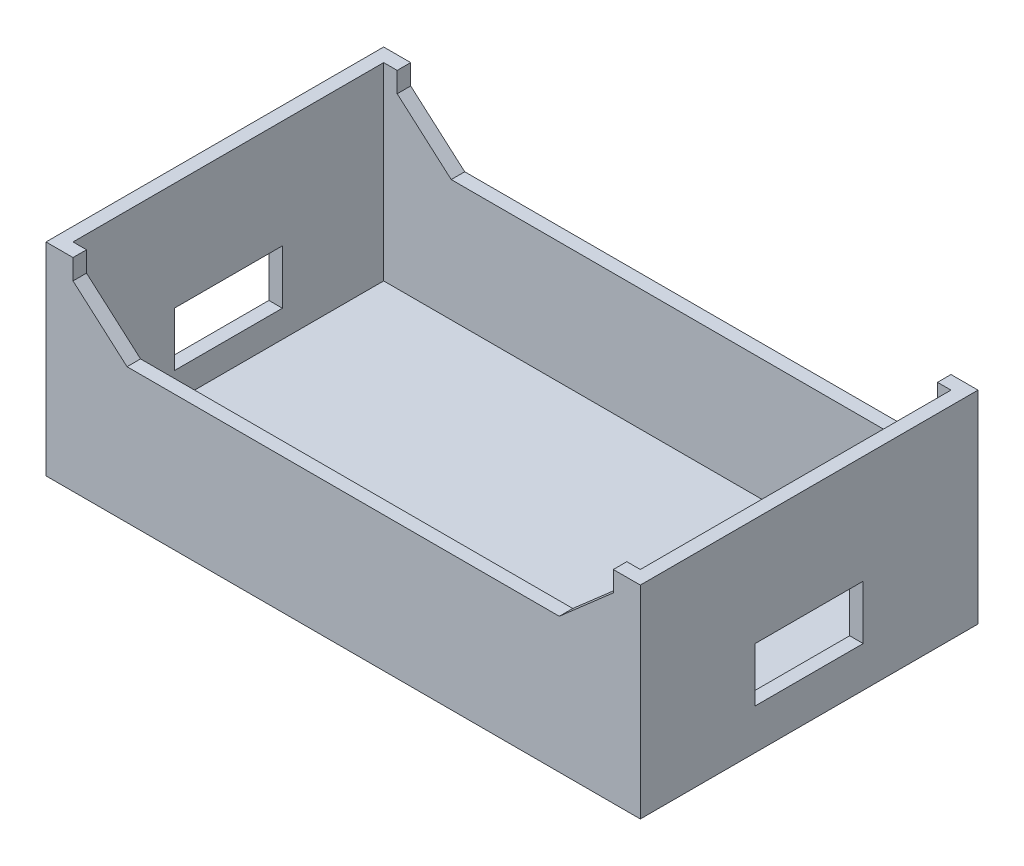
ISO-10303-21;
HEADER;
FILE_DESCRIPTION(('STEP AP214'),'2;1');
FILE_NAME('part.step','',(''),(''),'','','');
FILE_SCHEMA(('AUTOMOTIVE_DESIGN { 1 0 10303 214 1 1 1 1 }'));
ENDSEC;
DATA;
#1=APPLICATION_CONTEXT('core data for automotive mechanical design processes');
#2=APPLICATION_PROTOCOL_DEFINITION('international standard','automotive_design',2000,#1);
#3=PRODUCT_CONTEXT('',#1,'mechanical');
#4=PRODUCT('Part','Part','',(#3));
#5=PRODUCT_RELATED_PRODUCT_CATEGORY('part','',(#4));
#6=PRODUCT_DEFINITION_FORMATION('','',#4);
#7=PRODUCT_DEFINITION_CONTEXT('part definition',#1,'design');
#8=PRODUCT_DEFINITION('design','',#6,#7);
#9=PRODUCT_DEFINITION_SHAPE('','',#8);
#10=(LENGTH_UNIT() NAMED_UNIT(*) SI_UNIT(.MILLI.,.METRE.));
#11=(NAMED_UNIT(*) PLANE_ANGLE_UNIT() SI_UNIT($,.RADIAN.));
#12=(NAMED_UNIT(*) SI_UNIT($,.STERADIAN.) SOLID_ANGLE_UNIT());
#13=UNCERTAINTY_MEASURE_WITH_UNIT(LENGTH_MEASURE(1.E-05),#10,'distance_accuracy_value','');
#14=(GEOMETRIC_REPRESENTATION_CONTEXT(3) GLOBAL_UNCERTAINTY_ASSIGNED_CONTEXT((#13)) GLOBAL_UNIT_ASSIGNED_CONTEXT((#10,
#11,#12)) REPRESENTATION_CONTEXT('',''));
#15=CARTESIAN_POINT('',(0.,0.,0.));
#16=DIRECTION('',(0.,0.,1.));
#17=DIRECTION('',(1.,0.,0.));
#18=AXIS2_PLACEMENT_3D('',#15,#16,#17);
#19=CARTESIAN_POINT('',(21.,1.,-11.5));
#20=DIRECTION('',(0.,0.,-1.));
#21=DIRECTION('',(-1.,0.,0.));
#22=AXIS2_PLACEMENT_3D('',#19,#20,#21);
#23=PLANE('',#22);
#24=DIRECTION('',(0.,1.,0.));
#25=VECTOR('',#24,1.);
#26=CARTESIAN_POINT('',(21.,1.,-11.5));
#27=LINE('',#26,#25);
#28=CARTESIAN_POINT('',(21.,1.,-11.5));
#29=VERTEX_POINT('',#28);
#30=CARTESIAN_POINT('',(21.,15.,-11.5));
#31=VERTEX_POINT('',#30);
#32=EDGE_CURVE('E396',#29,#31,#27,.T.);
#33=ORIENTED_EDGE('',*,*,#32,.T.);
#34=DIRECTION('',(-1.,0.,0.));
#35=VECTOR('',#34,1.);
#36=CARTESIAN_POINT('',(0.,15.,-11.5));
#37=LINE('',#36,#35);
#38=CARTESIAN_POINT('',(20.,15.,-11.5));
#39=VERTEX_POINT('',#38);
#40=EDGE_CURVE('E297',#31,#39,#37,.T.);
#41=ORIENTED_EDGE('',*,*,#40,.T.);
#42=DIRECTION('',(0.,1.,0.));
#43=VECTOR('',#42,1.);
#44=CARTESIAN_POINT('',(20.,0.,-11.5));
#45=LINE('',#44,#43);
#46=CARTESIAN_POINT('',(20.,13.5,-11.5));
#47=VERTEX_POINT('',#46);
#48=EDGE_CURVE('E42',#47,#39,#45,.T.);
#49=ORIENTED_EDGE('',*,*,#48,.F.);
#50=DIRECTION('',(-0.752576694706878,-0.658504607868518,0.));
#51=VECTOR('',#50,1.);
#52=CARTESIAN_POINT('',(1.98230088495574,-2.26548672566371,-11.5));
#53=LINE('',#52,#51);
#54=CARTESIAN_POINT('',(16.,10.,-11.5));
#55=VERTEX_POINT('',#54);
#56=EDGE_CURVE('E295',#47,#55,#53,.T.);
#57=ORIENTED_EDGE('',*,*,#56,.T.);
#58=DIRECTION('',(-1.,0.,0.));
#59=VECTOR('',#58,1.);
#60=CARTESIAN_POINT('',(21.,10.,-11.5));
#61=LINE('',#60,#59);
#62=CARTESIAN_POINT('',(-16.,10.,-11.5));
#63=VERTEX_POINT('',#62);
#64=EDGE_CURVE('E379',#55,#63,#61,.T.);
#65=ORIENTED_EDGE('',*,*,#64,.T.);
#66=DIRECTION('',(0.752576694706878,-0.658504607868518,0.));
#67=VECTOR('',#66,1.);
#68=CARTESIAN_POINT('',(-1.98230088495574,-2.26548672566371,-11.5));
#69=LINE('',#68,#67);
#70=CARTESIAN_POINT('',(-20.,13.5,-11.5));
#71=VERTEX_POINT('',#70);
#72=EDGE_CURVE('E299',#71,#63,#69,.T.);
#73=ORIENTED_EDGE('',*,*,#72,.F.);
#74=DIRECTION('',(0.,1.,0.));
#75=VECTOR('',#74,1.);
#76=CARTESIAN_POINT('',(-20.,0.,-11.5));
#77=LINE('',#76,#75);
#78=CARTESIAN_POINT('',(-20.,15.,-11.5));
#79=VERTEX_POINT('',#78);
#80=EDGE_CURVE('E301',#71,#79,#77,.T.);
#81=ORIENTED_EDGE('',*,*,#80,.T.);
#82=DIRECTION('',(-1.,0.,0.));
#83=VECTOR('',#82,1.);
#84=CARTESIAN_POINT('',(0.,15.,-11.5));
#85=LINE('',#84,#83);
#86=CARTESIAN_POINT('',(-21.,15.,-11.5));
#87=VERTEX_POINT('',#86);
#88=EDGE_CURVE('E303',#79,#87,#85,.T.);
#89=ORIENTED_EDGE('',*,*,#88,.T.);
#90=DIRECTION('',(0.,1.,0.));
#91=VECTOR('',#90,1.);
#92=CARTESIAN_POINT('',(-21.,1.,-11.5));
#93=LINE('',#92,#91);
#94=CARTESIAN_POINT('',(-21.,1.,-11.5));
#95=VERTEX_POINT('',#94);
#96=EDGE_CURVE('E393',#95,#87,#93,.T.);
#97=ORIENTED_EDGE('',*,*,#96,.F.);
#98=DIRECTION('',(-1.,0.,0.));
#99=VECTOR('',#98,1.);
#100=CARTESIAN_POINT('',(21.,1.,-11.5));
#101=LINE('',#100,#99);
#102=EDGE_CURVE('E385',#29,#95,#101,.T.);
#103=ORIENTED_EDGE('',*,*,#102,.F.);
#104=EDGE_LOOP('',(#33,#41,#49,#57,#65,#73,#81,#89,#97,#103));
#105=FACE_BOUND('',#104,.T.);
#106=ADVANCED_FACE('F34',(#105),#23,.F.);
#107=CARTESIAN_POINT('',(21.,1.,11.5));
#108=DIRECTION('',(0.,0.,1.));
#109=DIRECTION('',(1.,0.,0.));
#110=AXIS2_PLACEMENT_3D('',#107,#108,#109);
#111=PLANE('',#110);
#112=DIRECTION('',(1.,0.,0.));
#113=VECTOR('',#112,1.);
#114=CARTESIAN_POINT('',(0.,15.,11.5));
#115=LINE('',#114,#113);
#116=CARTESIAN_POINT('',(20.,15.,11.5));
#117=VERTEX_POINT('',#116);
#118=CARTESIAN_POINT('',(21.,15.,11.5));
#119=VERTEX_POINT('',#118);
#120=EDGE_CURVE('E308',#117,#119,#115,.T.);
#121=ORIENTED_EDGE('',*,*,#120,.T.);
#122=DIRECTION('',(0.,1.,0.));
#123=VECTOR('',#122,1.);
#124=CARTESIAN_POINT('',(21.,1.,11.5));
#125=LINE('',#124,#123);
#126=CARTESIAN_POINT('',(21.,1.,11.5));
#127=VERTEX_POINT('',#126);
#128=EDGE_CURVE('E398',#127,#119,#125,.T.);
#129=ORIENTED_EDGE('',*,*,#128,.F.);
#130=DIRECTION('',(1.,0.,0.));
#131=VECTOR('',#130,1.);
#132=CARTESIAN_POINT('',(21.,1.,11.5));
#133=LINE('',#132,#131);
#134=CARTESIAN_POINT('',(-21.,1.,11.5));
#135=VERTEX_POINT('',#134);
#136=EDGE_CURVE('E378',#135,#127,#133,.T.);
#137=ORIENTED_EDGE('',*,*,#136,.F.);
#138=DIRECTION('',(0.,1.,0.));
#139=VECTOR('',#138,1.);
#140=CARTESIAN_POINT('',(-21.,1.,11.5));
#141=LINE('',#140,#139);
#142=CARTESIAN_POINT('',(-21.,15.,11.5));
#143=VERTEX_POINT('',#142);
#144=EDGE_CURVE('E388',#135,#143,#141,.T.);
#145=ORIENTED_EDGE('',*,*,#144,.T.);
#146=DIRECTION('',(1.,0.,0.));
#147=VECTOR('',#146,1.);
#148=CARTESIAN_POINT('',(0.,15.,11.5));
#149=LINE('',#148,#147);
#150=CARTESIAN_POINT('',(-20.,15.,11.5));
#151=VERTEX_POINT('',#150);
#152=EDGE_CURVE('E316',#143,#151,#149,.T.);
#153=ORIENTED_EDGE('',*,*,#152,.T.);
#154=DIRECTION('',(0.,-1.,0.));
#155=VECTOR('',#154,1.);
#156=CARTESIAN_POINT('',(-20.,0.,11.5));
#157=LINE('',#156,#155);
#158=CARTESIAN_POINT('',(-20.,13.5,11.5));
#159=VERTEX_POINT('',#158);
#160=EDGE_CURVE('E314',#151,#159,#157,.T.);
#161=ORIENTED_EDGE('',*,*,#160,.T.);
#162=DIRECTION('',(-0.752576694706878,0.658504607868518,0.));
#163=VECTOR('',#162,1.);
#164=CARTESIAN_POINT('',(-1.98230088495574,-2.26548672566371,11.5));
#165=LINE('',#164,#163);
#166=CARTESIAN_POINT('',(-16.,9.99999999999999,11.5));
#167=VERTEX_POINT('',#166);
#168=EDGE_CURVE('E311',#167,#159,#165,.T.);
#169=ORIENTED_EDGE('',*,*,#168,.F.);
#170=DIRECTION('',(1.,0.,0.));
#171=VECTOR('',#170,1.);
#172=CARTESIAN_POINT('',(21.,10.,11.5));
#173=LINE('',#172,#171);
#174=CARTESIAN_POINT('',(16.,10.,11.5));
#175=VERTEX_POINT('',#174);
#176=EDGE_CURVE('E366',#167,#175,#173,.T.);
#177=ORIENTED_EDGE('',*,*,#176,.T.);
#178=DIRECTION('',(0.752576694706878,0.658504607868518,0.));
#179=VECTOR('',#178,1.);
#180=CARTESIAN_POINT('',(1.98230088495574,-2.26548672566371,11.5));
#181=LINE('',#180,#179);
#182=CARTESIAN_POINT('',(20.,13.5,11.5));
#183=VERTEX_POINT('',#182);
#184=EDGE_CURVE('E306',#175,#183,#181,.T.);
#185=ORIENTED_EDGE('',*,*,#184,.T.);
#186=DIRECTION('',(0.,-1.,0.));
#187=VECTOR('',#186,1.);
#188=CARTESIAN_POINT('',(20.,0.,11.5));
#189=LINE('',#188,#187);
#190=EDGE_CURVE('E11',#117,#183,#189,.T.);
#191=ORIENTED_EDGE('',*,*,#190,.F.);
#192=EDGE_LOOP('',(#121,#129,#137,#145,#153,#161,#169,#177,#185,#191));
#193=FACE_BOUND('',#192,.T.);
#194=ADVANCED_FACE('F477',(#193),#111,.F.);
#195=CARTESIAN_POINT('',(22.,10.,12.5));
#196=DIRECTION('',(0.,0.,-1.));
#197=DIRECTION('',(-1.,0.,0.));
#198=AXIS2_PLACEMENT_3D('',#195,#196,#197);
#199=PLANE('',#198);
#200=DIRECTION('',(1.,0.,0.));
#201=VECTOR('',#200,1.);
#202=CARTESIAN_POINT('',(0.,15.,12.5));
#203=LINE('',#202,#201);
#204=CARTESIAN_POINT('',(-22.,15.,12.5));
#205=VERTEX_POINT('',#204);
#206=CARTESIAN_POINT('',(-20.,15.,12.5));
#207=VERTEX_POINT('',#206);
#208=EDGE_CURVE('E352',#205,#207,#203,.T.);
#209=ORIENTED_EDGE('',*,*,#208,.F.);
#210=DIRECTION('',(0.,-1.,0.));
#211=VECTOR('',#210,1.);
#212=CARTESIAN_POINT('',(-22.,10.,12.5));
#213=LINE('',#212,#211);
#214=CARTESIAN_POINT('',(-22.,0.,12.5));
#215=VERTEX_POINT('',#214);
#216=EDGE_CURVE('E423',#205,#215,#213,.T.);
#217=ORIENTED_EDGE('',*,*,#216,.T.);
#218=DIRECTION('',(1.,0.,0.));
#219=VECTOR('',#218,1.);
#220=CARTESIAN_POINT('',(22.,0.,12.5));
#221=LINE('',#220,#219);
#222=CARTESIAN_POINT('',(22.,0.,12.5));
#223=VERTEX_POINT('',#222);
#224=EDGE_CURVE('E410',#215,#223,#221,.T.);
#225=ORIENTED_EDGE('',*,*,#224,.T.);
#226=DIRECTION('',(0.,-1.,0.));
#227=VECTOR('',#226,1.);
#228=CARTESIAN_POINT('',(22.,10.,12.5));
#229=LINE('',#228,#227);
#230=CARTESIAN_POINT('',(22.,15.,12.5));
#231=VERTEX_POINT('',#230);
#232=EDGE_CURVE('E421',#231,#223,#229,.T.);
#233=ORIENTED_EDGE('',*,*,#232,.F.);
#234=DIRECTION('',(1.,0.,0.));
#235=VECTOR('',#234,1.);
#236=CARTESIAN_POINT('',(0.,15.,12.5));
#237=LINE('',#236,#235);
#238=CARTESIAN_POINT('',(20.,15.,12.5));
#239=VERTEX_POINT('',#238);
#240=EDGE_CURVE('E318',#239,#231,#237,.T.);
#241=ORIENTED_EDGE('',*,*,#240,.F.);
#242=DIRECTION('',(0.,-1.,0.));
#243=VECTOR('',#242,1.);
#244=CARTESIAN_POINT('',(20.,0.,12.5));
#245=LINE('',#244,#243);
#246=CARTESIAN_POINT('',(20.,13.5,12.5));
#247=VERTEX_POINT('',#246);
#248=EDGE_CURVE('E331',#239,#247,#245,.T.);
#249=ORIENTED_EDGE('',*,*,#248,.T.);
#250=DIRECTION('',(0.752576694706878,0.658504607868518,0.));
#251=VECTOR('',#250,1.);
#252=CARTESIAN_POINT('',(1.98230088495574,-2.26548672566371,12.5));
#253=LINE('',#252,#251);
#254=CARTESIAN_POINT('',(16.,10.,12.5));
#255=VERTEX_POINT('',#254);
#256=EDGE_CURVE('E323',#255,#247,#253,.T.);
#257=ORIENTED_EDGE('',*,*,#256,.F.);
#258=DIRECTION('',(1.,0.,0.));
#259=VECTOR('',#258,1.);
#260=CARTESIAN_POINT('',(22.,10.,12.5));
#261=LINE('',#260,#259);
#262=CARTESIAN_POINT('',(-16.,10.,12.5));
#263=VERTEX_POINT('',#262);
#264=EDGE_CURVE('E401',#263,#255,#261,.T.);
#265=ORIENTED_EDGE('',*,*,#264,.F.);
#266=DIRECTION('',(-0.752576694706878,0.658504607868518,0.));
#267=VECTOR('',#266,1.);
#268=CARTESIAN_POINT('',(-1.98230088495574,-2.26548672566371,12.5));
#269=LINE('',#268,#267);
#270=CARTESIAN_POINT('',(-20.,13.5,12.5));
#271=VERTEX_POINT('',#270);
#272=EDGE_CURVE('E339',#263,#271,#269,.T.);
#273=ORIENTED_EDGE('',*,*,#272,.T.);
#274=DIRECTION('',(0.,-1.,0.));
#275=VECTOR('',#274,1.);
#276=CARTESIAN_POINT('',(-20.,0.,12.5));
#277=LINE('',#276,#275);
#278=EDGE_CURVE('E359',#207,#271,#277,.T.);
#279=ORIENTED_EDGE('',*,*,#278,.F.);
#280=EDGE_LOOP('',(#209,#217,#225,#233,#241,#249,#257,#265,#273,#279));
#281=FACE_BOUND('',#280,.T.);
#282=ADVANCED_FACE('F490',(#281),#199,.F.);
#283=CARTESIAN_POINT('',(22.,10.,-12.5));
#284=DIRECTION('',(0.,0.,1.));
#285=DIRECTION('',(1.,0.,0.));
#286=AXIS2_PLACEMENT_3D('',#283,#284,#285);
#287=PLANE('',#286);
#288=DIRECTION('',(0.,-1.,0.));
#289=VECTOR('',#288,1.);
#290=CARTESIAN_POINT('',(-22.,10.,-12.5));
#291=LINE('',#290,#289);
#292=CARTESIAN_POINT('',(-22.,15.,-12.5));
#293=VERTEX_POINT('',#292);
#294=CARTESIAN_POINT('',(-22.,0.,-12.5));
#295=VERTEX_POINT('',#294);
#296=EDGE_CURVE('E407',#293,#295,#291,.T.);
#297=ORIENTED_EDGE('',*,*,#296,.F.);
#298=DIRECTION('',(1.,0.,0.));
#299=VECTOR('',#298,1.);
#300=CARTESIAN_POINT('',(0.,15.,-12.5));
#301=LINE('',#300,#299);
#302=CARTESIAN_POINT('',(-20.,15.,-12.5));
#303=VERTEX_POINT('',#302);
#304=EDGE_CURVE('E354',#293,#303,#301,.T.);
#305=ORIENTED_EDGE('',*,*,#304,.T.);
#306=DIRECTION('',(0.,-1.,0.));
#307=VECTOR('',#306,1.);
#308=CARTESIAN_POINT('',(-20.,0.,-12.5));
#309=LINE('',#308,#307);
#310=CARTESIAN_POINT('',(-20.,13.5,-12.5));
#311=VERTEX_POINT('',#310);
#312=EDGE_CURVE('E351',#303,#311,#309,.T.);
#313=ORIENTED_EDGE('',*,*,#312,.T.);
#314=DIRECTION('',(-0.752576694706878,0.658504607868518,0.));
#315=VECTOR('',#314,1.);
#316=CARTESIAN_POINT('',(-1.98230088495574,-2.26548672566371,-12.5));
#317=LINE('',#316,#315);
#318=CARTESIAN_POINT('',(-16.,10.,-12.5));
#319=VERTEX_POINT('',#318);
#320=EDGE_CURVE('E348',#319,#311,#317,.T.);
#321=ORIENTED_EDGE('',*,*,#320,.F.);
#322=DIRECTION('',(-1.,0.,0.));
#323=VECTOR('',#322,1.);
#324=CARTESIAN_POINT('',(22.,10.,-12.5));
#325=LINE('',#324,#323);
#326=CARTESIAN_POINT('',(16.,10.,-12.5));
#327=VERTEX_POINT('',#326);
#328=EDGE_CURVE('E404',#327,#319,#325,.T.);
#329=ORIENTED_EDGE('',*,*,#328,.F.);
#330=DIRECTION('',(0.752576694706878,0.658504607868518,0.));
#331=VECTOR('',#330,1.);
#332=CARTESIAN_POINT('',(1.98230088495574,-2.26548672566371,-12.5));
#333=LINE('',#332,#331);
#334=CARTESIAN_POINT('',(20.,13.5,-12.5));
#335=VERTEX_POINT('',#334);
#336=EDGE_CURVE('E326',#327,#335,#333,.T.);
#337=ORIENTED_EDGE('',*,*,#336,.T.);
#338=DIRECTION('',(0.,-1.,0.));
#339=VECTOR('',#338,1.);
#340=CARTESIAN_POINT('',(20.,0.,-12.5));
#341=LINE('',#340,#339);
#342=CARTESIAN_POINT('',(20.,15.,-12.5));
#343=VERTEX_POINT('',#342);
#344=EDGE_CURVE('E322',#343,#335,#341,.T.);
#345=ORIENTED_EDGE('',*,*,#344,.F.);
#346=DIRECTION('',(1.,0.,0.));
#347=VECTOR('',#346,1.);
#348=CARTESIAN_POINT('',(0.,15.,-12.5));
#349=LINE('',#348,#347);
#350=CARTESIAN_POINT('',(22.,15.,-12.5));
#351=VERTEX_POINT('',#350);
#352=EDGE_CURVE('E319',#343,#351,#349,.T.);
#353=ORIENTED_EDGE('',*,*,#352,.T.);
#354=DIRECTION('',(0.,-1.,0.));
#355=VECTOR('',#354,1.);
#356=CARTESIAN_POINT('',(22.,10.,-12.5));
#357=LINE('',#356,#355);
#358=CARTESIAN_POINT('',(22.,0.,-12.5));
#359=VERTEX_POINT('',#358);
#360=EDGE_CURVE('E419',#351,#359,#357,.T.);
#361=ORIENTED_EDGE('',*,*,#360,.T.);
#362=DIRECTION('',(-1.,0.,0.));
#363=VECTOR('',#362,1.);
#364=CARTESIAN_POINT('',(22.,0.,-12.5));
#365=LINE('',#364,#363);
#366=EDGE_CURVE('E405',#359,#295,#365,.T.);
#367=ORIENTED_EDGE('',*,*,#366,.T.);
#368=EDGE_LOOP('',(#297,#305,#313,#321,#329,#337,#345,#353,#361,#367));
#369=FACE_BOUND('',#368,.T.);
#370=ADVANCED_FACE('F439',(#369),#287,.F.);
#371=CARTESIAN_POINT('',(0.,15.,-12.5));
#372=DIRECTION('',(0.,-1.,0.));
#373=DIRECTION('',(0.,0.,-1.));
#374=AXIS2_PLACEMENT_3D('',#371,#372,#373);
#375=PLANE('',#374);
#376=ORIENTED_EDGE('',*,*,#304,.F.);
#377=DIRECTION('',(0.,0.,-1.));
#378=VECTOR('',#377,1.);
#379=CARTESIAN_POINT('',(-22.,15.,-12.5));
#380=LINE('',#379,#378);
#381=EDGE_CURVE('E291',#205,#293,#380,.T.);
#382=ORIENTED_EDGE('',*,*,#381,.F.);
#383=ORIENTED_EDGE('',*,*,#208,.T.);
#384=DIRECTION('',(0.,0.,1.));
#385=VECTOR('',#384,1.);
#386=CARTESIAN_POINT('',(-20.,15.,-12.5));
#387=LINE('',#386,#385);
#388=EDGE_CURVE('E367',#151,#207,#387,.T.);
#389=ORIENTED_EDGE('',*,*,#388,.F.);
#390=ORIENTED_EDGE('',*,*,#152,.F.);
#391=DIRECTION('',(0.,0.,-1.));
#392=VECTOR('',#391,1.);
#393=CARTESIAN_POINT('',(-21.,15.,0.));
#394=LINE('',#393,#392);
#395=EDGE_CURVE('E288',#143,#87,#394,.T.);
#396=ORIENTED_EDGE('',*,*,#395,.T.);
#397=ORIENTED_EDGE('',*,*,#88,.F.);
#398=EDGE_CURVE('E363',#303,#79,#387,.T.);
#399=ORIENTED_EDGE('',*,*,#398,.F.);
#400=EDGE_LOOP('',(#376,#382,#383,#389,#390,#396,#397,#399));
#401=FACE_BOUND('',#400,.T.);
#402=ADVANCED_FACE('F460',(#401),#375,.F.);
#403=CARTESIAN_POINT('',(0.,15.,-12.5));
#404=DIRECTION('',(0.,-1.,0.));
#405=DIRECTION('',(1.,0.,0.));
#406=AXIS2_PLACEMENT_3D('',#403,#404,#405);
#407=PLANE('',#406);
#408=ORIENTED_EDGE('',*,*,#240,.T.);
#409=DIRECTION('',(0.,0.,1.));
#410=VECTOR('',#409,1.);
#411=CARTESIAN_POINT('',(22.,15.,-12.5));
#412=LINE('',#411,#410);
#413=EDGE_CURVE('E293',#351,#231,#412,.T.);
#414=ORIENTED_EDGE('',*,*,#413,.F.);
#415=ORIENTED_EDGE('',*,*,#352,.F.);
#416=DIRECTION('',(0.,0.,1.));
#417=VECTOR('',#416,1.);
#418=CARTESIAN_POINT('',(20.,15.,-12.5));
#419=LINE('',#418,#417);
#420=EDGE_CURVE('E345',#343,#39,#419,.T.);
#421=ORIENTED_EDGE('',*,*,#420,.T.);
#422=ORIENTED_EDGE('',*,*,#40,.F.);
#423=DIRECTION('',(0.,0.,-1.));
#424=VECTOR('',#423,1.);
#425=CARTESIAN_POINT('',(21.,15.,0.));
#426=LINE('',#425,#424);
#427=EDGE_CURVE('E285',#119,#31,#426,.T.);
#428=ORIENTED_EDGE('',*,*,#427,.F.);
#429=ORIENTED_EDGE('',*,*,#120,.F.);
#430=EDGE_CURVE('E328',#117,#239,#419,.T.);
#431=ORIENTED_EDGE('',*,*,#430,.T.);
#432=EDGE_LOOP('',(#408,#414,#415,#421,#422,#428,#429,#431));
#433=FACE_BOUND('',#432,.T.);
#434=ADVANCED_FACE('F433',(#433),#407,.F.);
#435=CARTESIAN_POINT('',(21.,1.,11.5));
#436=DIRECTION('',(1.,0.,0.));
#437=DIRECTION('',(0.,0.,-1.));
#438=AXIS2_PLACEMENT_3D('',#435,#436,#437);
#439=PLANE('',#438);
#440=DIRECTION('',(0.,0.,1.));
#441=VECTOR('',#440,1.);
#442=CARTESIAN_POINT('',(21.,7.00000000000001,11.5));
#443=LINE('',#442,#441);
#444=CARTESIAN_POINT('',(21.,7.00000000000001,-4.00000000000001));
#445=VERTEX_POINT('',#444);
#446=CARTESIAN_POINT('',(21.,7.00000000000001,3.99999999999999));
#447=VERTEX_POINT('',#446);
#448=EDGE_CURVE('E257',#445,#447,#443,.T.);
#449=ORIENTED_EDGE('',*,*,#448,.T.);
#450=DIRECTION('',(0.,-1.,0.));
#451=VECTOR('',#450,1.);
#452=CARTESIAN_POINT('',(21.,1.,3.99999999999999));
#453=LINE('',#452,#451);
#454=CARTESIAN_POINT('',(21.,3.00000000000001,3.99999999999999));
#455=VERTEX_POINT('',#454);
#456=EDGE_CURVE('E282',#447,#455,#453,.T.);
#457=ORIENTED_EDGE('',*,*,#456,.T.);
#458=DIRECTION('',(0.,0.,-1.));
#459=VECTOR('',#458,1.);
#460=CARTESIAN_POINT('',(21.,3.00000000000001,11.5));
#461=LINE('',#460,#459);
#462=CARTESIAN_POINT('',(21.,3.00000000000001,-4.00000000000001));
#463=VERTEX_POINT('',#462);
#464=EDGE_CURVE('E273',#455,#463,#461,.T.);
#465=ORIENTED_EDGE('',*,*,#464,.T.);
#466=DIRECTION('',(0.,1.,0.));
#467=VECTOR('',#466,1.);
#468=CARTESIAN_POINT('',(21.,0.999999999999997,-4.00000000000001));
#469=LINE('',#468,#467);
#470=EDGE_CURVE('E264',#463,#445,#469,.T.);
#471=ORIENTED_EDGE('',*,*,#470,.T.);
#472=EDGE_LOOP('',(#449,#457,#465,#471));
#473=FACE_BOUND('',#472,.T.);
#474=ORIENTED_EDGE('',*,*,#128,.T.);
#475=ORIENTED_EDGE('',*,*,#427,.T.);
#476=ORIENTED_EDGE('',*,*,#32,.F.);
#477=DIRECTION('',(0.,0.,-1.));
#478=VECTOR('',#477,1.);
#479=CARTESIAN_POINT('',(21.,1.,11.5));
#480=LINE('',#479,#478);
#481=EDGE_CURVE('E382',#127,#29,#480,.T.);
#482=ORIENTED_EDGE('',*,*,#481,.F.);
#483=EDGE_LOOP('',(#474,#475,#476,#482));
#484=FACE_BOUND('',#483,.T.);
#485=ADVANCED_FACE('F473',(#473,#484),#439,.F.);
#486=CARTESIAN_POINT('',(-21.,1.,11.5));
#487=DIRECTION('',(-1.,0.,0.));
#488=DIRECTION('',(0.,0.,1.));
#489=AXIS2_PLACEMENT_3D('',#486,#487,#488);
#490=PLANE('',#489);
#491=DIRECTION('',(0.,0.,1.));
#492=VECTOR('',#491,1.);
#493=CARTESIAN_POINT('',(-21.,3.00000000000001,11.5));
#494=LINE('',#493,#492);
#495=CARTESIAN_POINT('',(-21.,3.00000000000001,-4.00000000000001));
#496=VERTEX_POINT('',#495);
#497=CARTESIAN_POINT('',(-21.,3.00000000000001,3.99999999999999));
#498=VERTEX_POINT('',#497);
#499=EDGE_CURVE('E270',#496,#498,#494,.T.);
#500=ORIENTED_EDGE('',*,*,#499,.T.);
#501=DIRECTION('',(0.,1.,0.));
#502=VECTOR('',#501,1.);
#503=CARTESIAN_POINT('',(-21.,1.,3.99999999999999));
#504=LINE('',#503,#502);
#505=CARTESIAN_POINT('',(-21.,7.00000000000001,3.99999999999999));
#506=VERTEX_POINT('',#505);
#507=EDGE_CURVE('E279',#498,#506,#504,.T.);
#508=ORIENTED_EDGE('',*,*,#507,.T.);
#509=DIRECTION('',(0.,0.,-1.));
#510=VECTOR('',#509,1.);
#511=CARTESIAN_POINT('',(-21.,7.00000000000001,11.5));
#512=LINE('',#511,#510);
#513=CARTESIAN_POINT('',(-21.,7.00000000000001,-4.00000000000001));
#514=VERTEX_POINT('',#513);
#515=EDGE_CURVE('E255',#506,#514,#512,.T.);
#516=ORIENTED_EDGE('',*,*,#515,.T.);
#517=DIRECTION('',(0.,-1.,0.));
#518=VECTOR('',#517,1.);
#519=CARTESIAN_POINT('',(-21.,0.999999999999997,-4.00000000000001));
#520=LINE('',#519,#518);
#521=EDGE_CURVE('E224',#514,#496,#520,.T.);
#522=ORIENTED_EDGE('',*,*,#521,.T.);
#523=EDGE_LOOP('',(#500,#508,#516,#522));
#524=FACE_BOUND('',#523,.T.);
#525=ORIENTED_EDGE('',*,*,#96,.T.);
#526=ORIENTED_EDGE('',*,*,#395,.F.);
#527=ORIENTED_EDGE('',*,*,#144,.F.);
#528=DIRECTION('',(0.,0.,1.));
#529=VECTOR('',#528,1.);
#530=CARTESIAN_POINT('',(-21.,1.,11.5));
#531=LINE('',#530,#529);
#532=EDGE_CURVE('E375',#95,#135,#531,.T.);
#533=ORIENTED_EDGE('',*,*,#532,.F.);
#534=EDGE_LOOP('',(#525,#526,#527,#533));
#535=FACE_BOUND('',#534,.T.);
#536=ADVANCED_FACE('F465',(#524,#535),#490,.F.);
#537=CARTESIAN_POINT('',(-20.,0.,-12.5));
#538=DIRECTION('',(-1.,0.,0.));
#539=DIRECTION('',(0.,0.,1.));
#540=AXIS2_PLACEMENT_3D('',#537,#538,#539);
#541=PLANE('',#540);
#542=ORIENTED_EDGE('',*,*,#160,.F.);
#543=ORIENTED_EDGE('',*,*,#388,.T.);
#544=ORIENTED_EDGE('',*,*,#278,.T.);
#545=DIRECTION('',(0.,0.,1.));
#546=VECTOR('',#545,1.);
#547=CARTESIAN_POINT('',(-20.,13.5,-12.5));
#548=LINE('',#547,#546);
#549=EDGE_CURVE('E371',#159,#271,#548,.T.);
#550=ORIENTED_EDGE('',*,*,#549,.F.);
#551=EDGE_LOOP('',(#542,#543,#544,#550));
#552=FACE_BOUND('',#551,.T.);
#553=ADVANCED_FACE('F506',(#552),#541,.F.);
#554=ORIENTED_EDGE('',*,*,#80,.F.);
#555=EDGE_CURVE('E368',#311,#71,#548,.T.);
#556=ORIENTED_EDGE('',*,*,#555,.F.);
#557=ORIENTED_EDGE('',*,*,#312,.F.);
#558=ORIENTED_EDGE('',*,*,#398,.T.);
#559=EDGE_LOOP('',(#554,#556,#557,#558));
#560=FACE_BOUND('',#559,.T.);
#561=ADVANCED_FACE('F457',(#560),#541,.F.);
#562=CARTESIAN_POINT('',(-1.98230088495574,-2.26548672566371,-12.5));
#563=DIRECTION('',(0.658504607868518,0.752576694706878,0.));
#564=DIRECTION('',(-0.752576694706878,0.658504607868518,0.));
#565=AXIS2_PLACEMENT_3D('',#562,#563,#564);
#566=PLANE('',#565);
#567=DIRECTION('',(0.,0.,1.));
#568=VECTOR('',#567,1.);
#569=CARTESIAN_POINT('',(-16.,10.,-12.5));
#570=LINE('',#569,#568);
#571=EDGE_CURVE('E356',#167,#263,#570,.T.);
#572=ORIENTED_EDGE('',*,*,#571,.F.);
#573=ORIENTED_EDGE('',*,*,#168,.T.);
#574=ORIENTED_EDGE('',*,*,#549,.T.);
#575=ORIENTED_EDGE('',*,*,#272,.F.);
#576=EDGE_LOOP('',(#572,#573,#574,#575));
#577=FACE_BOUND('',#576,.T.);
#578=ADVANCED_FACE('F509',(#577),#566,.T.);
#579=ORIENTED_EDGE('',*,*,#555,.T.);
#580=ORIENTED_EDGE('',*,*,#72,.T.);
#581=EDGE_CURVE('E372',#319,#63,#570,.T.);
#582=ORIENTED_EDGE('',*,*,#581,.F.);
#583=ORIENTED_EDGE('',*,*,#320,.T.);
#584=EDGE_LOOP('',(#579,#580,#582,#583));
#585=FACE_BOUND('',#584,.T.);
#586=ADVANCED_FACE('F451',(#585),#566,.T.);
#587=CARTESIAN_POINT('',(1.98230088495574,-2.26548672566371,-12.5));
#588=DIRECTION('',(0.658504607868518,-0.752576694706878,0.));
#589=DIRECTION('',(0.752576694706878,0.658504607868518,0.));
#590=AXIS2_PLACEMENT_3D('',#587,#588,#589);
#591=PLANE('',#590);
#592=ORIENTED_EDGE('',*,*,#184,.F.);
#593=DIRECTION('',(0.,0.,1.));
#594=VECTOR('',#593,1.);
#595=CARTESIAN_POINT('',(16.,10.,-12.5));
#596=LINE('',#595,#594);
#597=EDGE_CURVE('E340',#175,#255,#596,.T.);
#598=ORIENTED_EDGE('',*,*,#597,.T.);
#599=ORIENTED_EDGE('',*,*,#256,.T.);
#600=DIRECTION('',(0.,0.,1.));
#601=VECTOR('',#600,1.);
#602=CARTESIAN_POINT('',(20.,13.5,-12.5));
#603=LINE('',#602,#601);
#604=EDGE_CURVE('E344',#183,#247,#603,.T.);
#605=ORIENTED_EDGE('',*,*,#604,.F.);
#606=EDGE_LOOP('',(#592,#598,#599,#605));
#607=FACE_BOUND('',#606,.T.);
#608=ADVANCED_FACE('F483',(#607),#591,.F.);
#609=ORIENTED_EDGE('',*,*,#56,.F.);
#610=EDGE_CURVE('E341',#335,#47,#603,.T.);
#611=ORIENTED_EDGE('',*,*,#610,.F.);
#612=ORIENTED_EDGE('',*,*,#336,.F.);
#613=EDGE_CURVE('E336',#327,#55,#596,.T.);
#614=ORIENTED_EDGE('',*,*,#613,.T.);
#615=EDGE_LOOP('',(#609,#611,#612,#614));
#616=FACE_BOUND('',#615,.T.);
#617=ADVANCED_FACE('F444',(#616),#591,.F.);
#618=CARTESIAN_POINT('',(20.,0.,-12.5));
#619=DIRECTION('',(-1.,0.,0.));
#620=DIRECTION('',(0.,0.,1.));
#621=AXIS2_PLACEMENT_3D('',#618,#619,#620);
#622=PLANE('',#621);
#623=ORIENTED_EDGE('',*,*,#430,.F.);
#624=ORIENTED_EDGE('',*,*,#190,.T.);
#625=ORIENTED_EDGE('',*,*,#604,.T.);
#626=ORIENTED_EDGE('',*,*,#248,.F.);
#627=EDGE_LOOP('',(#623,#624,#625,#626));
#628=FACE_BOUND('',#627,.T.);
#629=ADVANCED_FACE('F480',(#628),#622,.T.);
#630=ORIENTED_EDGE('',*,*,#610,.T.);
#631=ORIENTED_EDGE('',*,*,#48,.T.);
#632=ORIENTED_EDGE('',*,*,#420,.F.);
#633=ORIENTED_EDGE('',*,*,#344,.T.);
#634=EDGE_LOOP('',(#630,#631,#632,#633));
#635=FACE_BOUND('',#634,.T.);
#636=ADVANCED_FACE('F426',(#635),#622,.T.);
#637=CARTESIAN_POINT('',(22.,10.,12.5));
#638=DIRECTION('',(-1.,0.,0.));
#639=DIRECTION('',(0.,0.,1.));
#640=AXIS2_PLACEMENT_3D('',#637,#638,#639);
#641=PLANE('',#640);
#642=DIRECTION('',(0.,0.,1.));
#643=VECTOR('',#642,1.);
#644=CARTESIAN_POINT('',(22.,3.00000000000001,12.5));
#645=LINE('',#644,#643);
#646=CARTESIAN_POINT('',(22.,3.00000000000001,-4.00000000000001));
#647=VERTEX_POINT('',#646);
#648=CARTESIAN_POINT('',(22.,3.00000000000001,3.99999999999999));
#649=VERTEX_POINT('',#648);
#650=EDGE_CURVE('E267',#647,#649,#645,.T.);
#651=ORIENTED_EDGE('',*,*,#650,.T.);
#652=DIRECTION('',(0.,1.,0.));
#653=VECTOR('',#652,1.);
#654=CARTESIAN_POINT('',(22.,10.,3.99999999999999));
#655=LINE('',#654,#653);
#656=CARTESIAN_POINT('',(22.,7.00000000000001,3.99999999999999));
#657=VERTEX_POINT('',#656);
#658=EDGE_CURVE('E276',#649,#657,#655,.T.);
#659=ORIENTED_EDGE('',*,*,#658,.T.);
#660=DIRECTION('',(0.,0.,-1.));
#661=VECTOR('',#660,1.);
#662=CARTESIAN_POINT('',(22.,7.00000000000001,12.5));
#663=LINE('',#662,#661);
#664=CARTESIAN_POINT('',(22.,7.00000000000001,-4.00000000000001));
#665=VERTEX_POINT('',#664);
#666=EDGE_CURVE('E252',#657,#665,#663,.T.);
#667=ORIENTED_EDGE('',*,*,#666,.T.);
#668=DIRECTION('',(0.,-1.,0.));
#669=VECTOR('',#668,1.);
#670=CARTESIAN_POINT('',(22.,10.,-4.00000000000001));
#671=LINE('',#670,#669);
#672=EDGE_CURVE('E260',#665,#647,#671,.T.);
#673=ORIENTED_EDGE('',*,*,#672,.T.);
#674=EDGE_LOOP('',(#651,#659,#667,#673));
#675=FACE_BOUND('',#674,.T.);
#676=ORIENTED_EDGE('',*,*,#413,.T.);
#677=ORIENTED_EDGE('',*,*,#232,.T.);
#678=DIRECTION('',(0.,0.,-1.));
#679=VECTOR('',#678,1.);
#680=CARTESIAN_POINT('',(22.,0.,12.5));
#681=LINE('',#680,#679);
#682=EDGE_CURVE('E413',#223,#359,#681,.T.);
#683=ORIENTED_EDGE('',*,*,#682,.T.);
#684=ORIENTED_EDGE('',*,*,#360,.F.);
#685=EDGE_LOOP('',(#676,#677,#683,#684));
#686=FACE_BOUND('',#685,.T.);
#687=ADVANCED_FACE('F495',(#675,#686),#641,.F.);
#688=CARTESIAN_POINT('',(0.,10.,0.));
#689=DIRECTION('',(0.,1.,0.));
#690=DIRECTION('',(0.,0.,1.));
#691=AXIS2_PLACEMENT_3D('',#688,#689,#690);
#692=PLANE('',#691);
#693=ORIENTED_EDGE('',*,*,#264,.T.);
#694=ORIENTED_EDGE('',*,*,#597,.F.);
#695=ORIENTED_EDGE('',*,*,#176,.F.);
#696=ORIENTED_EDGE('',*,*,#571,.T.);
#697=EDGE_LOOP('',(#693,#694,#695,#696));
#698=FACE_BOUND('',#697,.T.);
#699=ADVANCED_FACE('F513',(#698),#692,.T.);
#700=ORIENTED_EDGE('',*,*,#64,.F.);
#701=ORIENTED_EDGE('',*,*,#613,.F.);
#702=ORIENTED_EDGE('',*,*,#328,.T.);
#703=ORIENTED_EDGE('',*,*,#581,.T.);
#704=EDGE_LOOP('',(#700,#701,#702,#703));
#705=FACE_BOUND('',#704,.T.);
#706=ADVANCED_FACE('F449',(#705),#692,.T.);
#707=CARTESIAN_POINT('',(-22.,10.,12.5));
#708=DIRECTION('',(1.,0.,0.));
#709=DIRECTION('',(0.,0.,-1.));
#710=AXIS2_PLACEMENT_3D('',#707,#708,#709);
#711=PLANE('',#710);
#712=DIRECTION('',(0.,0.,-1.));
#713=VECTOR('',#712,1.);
#714=CARTESIAN_POINT('',(-22.,7.00000000000001,-4.00000000000001));
#715=LINE('',#714,#713);
#716=CARTESIAN_POINT('',(-22.,7.00000000000001,3.99999999999999));
#717=VERTEX_POINT('',#716);
#718=CARTESIAN_POINT('',(-22.,7.00000000000001,-4.00000000000001));
#719=VERTEX_POINT('',#718);
#720=EDGE_CURVE('E230',#717,#719,#715,.T.);
#721=ORIENTED_EDGE('',*,*,#720,.F.);
#722=DIRECTION('',(0.,1.,0.));
#723=VECTOR('',#722,1.);
#724=CARTESIAN_POINT('',(-22.,7.00000000000001,3.99999999999999));
#725=LINE('',#724,#723);
#726=CARTESIAN_POINT('',(-22.,3.00000000000001,3.99999999999999));
#727=VERTEX_POINT('',#726);
#728=EDGE_CURVE('E236',#727,#717,#725,.T.);
#729=ORIENTED_EDGE('',*,*,#728,.F.);
#730=DIRECTION('',(0.,0.,1.));
#731=VECTOR('',#730,1.);
#732=CARTESIAN_POINT('',(-22.,3.00000000000001,-4.00000000000001));
#733=LINE('',#732,#731);
#734=CARTESIAN_POINT('',(-22.,3.00000000000001,-4.00000000000001));
#735=VERTEX_POINT('',#734);
#736=EDGE_CURVE('E240',#735,#727,#733,.T.);
#737=ORIENTED_EDGE('',*,*,#736,.F.);
#738=DIRECTION('',(0.,-1.,0.));
#739=VECTOR('',#738,1.);
#740=CARTESIAN_POINT('',(-22.,7.00000000000001,-4.00000000000001));
#741=LINE('',#740,#739);
#742=EDGE_CURVE('E221',#719,#735,#741,.T.);
#743=ORIENTED_EDGE('',*,*,#742,.F.);
#744=EDGE_LOOP('',(#721,#729,#737,#743));
#745=FACE_BOUND('',#744,.T.);
#746=ORIENTED_EDGE('',*,*,#381,.T.);
#747=ORIENTED_EDGE('',*,*,#296,.T.);
#748=DIRECTION('',(0.,0.,1.));
#749=VECTOR('',#748,1.);
#750=CARTESIAN_POINT('',(-22.,0.,12.5));
#751=LINE('',#750,#749);
#752=EDGE_CURVE('E395',#295,#215,#751,.T.);
#753=ORIENTED_EDGE('',*,*,#752,.T.);
#754=ORIENTED_EDGE('',*,*,#216,.F.);
#755=EDGE_LOOP('',(#746,#747,#753,#754));
#756=FACE_BOUND('',#755,.T.);
#757=ADVANCED_FACE('F36',(#745,#756),#711,.F.);
#758=CARTESIAN_POINT('',(0.,0.,0.));
#759=DIRECTION('',(0.,1.,0.));
#760=DIRECTION('',(0.,0.,1.));
#761=AXIS2_PLACEMENT_3D('',#758,#759,#760);
#762=PLANE('',#761);
#763=ORIENTED_EDGE('',*,*,#752,.F.);
#764=ORIENTED_EDGE('',*,*,#366,.F.);
#765=ORIENTED_EDGE('',*,*,#682,.F.);
#766=ORIENTED_EDGE('',*,*,#224,.F.);
#767=EDGE_LOOP('',(#763,#764,#765,#766));
#768=FACE_BOUND('',#767,.T.);
#769=ADVANCED_FACE('F499',(#768),#762,.F.);
#770=CARTESIAN_POINT('',(0.,1.,0.));
#771=DIRECTION('',(0.,1.,0.));
#772=DIRECTION('',(0.,0.,1.));
#773=AXIS2_PLACEMENT_3D('',#770,#771,#772);
#774=PLANE('',#773);
#775=ORIENTED_EDGE('',*,*,#532,.T.);
#776=ORIENTED_EDGE('',*,*,#136,.T.);
#777=ORIENTED_EDGE('',*,*,#481,.T.);
#778=ORIENTED_EDGE('',*,*,#102,.T.);
#779=EDGE_LOOP('',(#775,#776,#777,#778));
#780=FACE_BOUND('',#779,.T.);
#781=ADVANCED_FACE('F470',(#780),#774,.T.);
#782=CARTESIAN_POINT('',(65.,7.00000000000001,-4.00000000000001));
#783=DIRECTION('',(0.,1.,0.));
#784=DIRECTION('',(0.,0.,1.));
#785=AXIS2_PLACEMENT_3D('',#782,#783,#784);
#786=PLANE('',#785);
#787=DIRECTION('',(-1.,0.,0.));
#788=VECTOR('',#787,1.);
#789=CARTESIAN_POINT('',(65.,7.00000000000001,3.99999999999999));
#790=LINE('',#789,#788);
#791=EDGE_CURVE('E233',#506,#717,#790,.T.);
#792=ORIENTED_EDGE('',*,*,#791,.T.);
#793=ORIENTED_EDGE('',*,*,#720,.T.);
#794=DIRECTION('',(-1.,0.,0.));
#795=VECTOR('',#794,1.);
#796=CARTESIAN_POINT('',(65.,7.00000000000001,-4.00000000000001));
#797=LINE('',#796,#795);
#798=EDGE_CURVE('E57',#514,#719,#797,.T.);
#799=ORIENTED_EDGE('',*,*,#798,.F.);
#800=ORIENTED_EDGE('',*,*,#515,.F.);
#801=EDGE_LOOP('',(#792,#793,#799,#800));
#802=FACE_BOUND('',#801,.T.);
#803=ADVANCED_FACE('F231',(#802),#786,.F.);
#804=CARTESIAN_POINT('',(65.,7.00000000000001,-4.00000000000001));
#805=DIRECTION('',(0.,0.,-1.));
#806=DIRECTION('',(0.,1.,0.));
#807=AXIS2_PLACEMENT_3D('',#804,#805,#806);
#808=PLANE('',#807);
#809=ORIENTED_EDGE('',*,*,#798,.T.);
#810=ORIENTED_EDGE('',*,*,#742,.T.);
#811=DIRECTION('',(-1.,0.,0.));
#812=VECTOR('',#811,1.);
#813=CARTESIAN_POINT('',(65.,3.00000000000001,-4.00000000000001));
#814=LINE('',#813,#812);
#815=EDGE_CURVE('E249',#496,#735,#814,.T.);
#816=ORIENTED_EDGE('',*,*,#815,.F.);
#817=ORIENTED_EDGE('',*,*,#521,.F.);
#818=EDGE_LOOP('',(#809,#810,#816,#817));
#819=FACE_BOUND('',#818,.T.);
#820=ADVANCED_FACE('F218',(#819),#808,.F.);
#821=CARTESIAN_POINT('',(65.,3.00000000000001,-4.00000000000001));
#822=DIRECTION('',(0.,-1.,0.));
#823=DIRECTION('',(0.,0.,-1.));
#824=AXIS2_PLACEMENT_3D('',#821,#822,#823);
#825=PLANE('',#824);
#826=ORIENTED_EDGE('',*,*,#815,.T.);
#827=ORIENTED_EDGE('',*,*,#736,.T.);
#828=DIRECTION('',(-1.,0.,0.));
#829=VECTOR('',#828,1.);
#830=CARTESIAN_POINT('',(65.,3.00000000000001,3.99999999999999));
#831=LINE('',#830,#829);
#832=EDGE_CURVE('E245',#498,#727,#831,.T.);
#833=ORIENTED_EDGE('',*,*,#832,.F.);
#834=ORIENTED_EDGE('',*,*,#499,.F.);
#835=EDGE_LOOP('',(#826,#827,#833,#834));
#836=FACE_BOUND('',#835,.T.);
#837=ADVANCED_FACE('F543',(#836),#825,.F.);
#838=CARTESIAN_POINT('',(65.,7.00000000000001,3.99999999999999));
#839=DIRECTION('',(0.,0.,1.));
#840=DIRECTION('',(1.,0.,0.));
#841=AXIS2_PLACEMENT_3D('',#838,#839,#840);
#842=PLANE('',#841);
#843=ORIENTED_EDGE('',*,*,#832,.T.);
#844=ORIENTED_EDGE('',*,*,#728,.T.);
#845=ORIENTED_EDGE('',*,*,#791,.F.);
#846=ORIENTED_EDGE('',*,*,#507,.F.);
#847=EDGE_LOOP('',(#843,#844,#845,#846));
#848=FACE_BOUND('',#847,.T.);
#849=ADVANCED_FACE('F545',(#848),#842,.F.);
#850=EDGE_CURVE('E49',#657,#447,#790,.T.);
#851=ORIENTED_EDGE('',*,*,#850,.F.);
#852=ORIENTED_EDGE('',*,*,#658,.F.);
#853=EDGE_CURVE('E247',#649,#455,#831,.T.);
#854=ORIENTED_EDGE('',*,*,#853,.T.);
#855=ORIENTED_EDGE('',*,*,#456,.F.);
#856=EDGE_LOOP('',(#851,#852,#854,#855));
#857=FACE_BOUND('',#856,.T.);
#858=ADVANCED_FACE('F547',(#857),#842,.F.);
#859=ORIENTED_EDGE('',*,*,#853,.F.);
#860=ORIENTED_EDGE('',*,*,#650,.F.);
#861=EDGE_CURVE('E248',#647,#463,#814,.T.);
#862=ORIENTED_EDGE('',*,*,#861,.T.);
#863=ORIENTED_EDGE('',*,*,#464,.F.);
#864=EDGE_LOOP('',(#859,#860,#862,#863));
#865=FACE_BOUND('',#864,.T.);
#866=ADVANCED_FACE('F553',(#865),#825,.F.);
#867=ORIENTED_EDGE('',*,*,#861,.F.);
#868=ORIENTED_EDGE('',*,*,#672,.F.);
#869=EDGE_CURVE('E226',#665,#445,#797,.T.);
#870=ORIENTED_EDGE('',*,*,#869,.T.);
#871=ORIENTED_EDGE('',*,*,#470,.F.);
#872=EDGE_LOOP('',(#867,#868,#870,#871));
#873=FACE_BOUND('',#872,.T.);
#874=ADVANCED_FACE('F768',(#873),#808,.F.);
#875=ORIENTED_EDGE('',*,*,#869,.F.);
#876=ORIENTED_EDGE('',*,*,#666,.F.);
#877=ORIENTED_EDGE('',*,*,#850,.T.);
#878=ORIENTED_EDGE('',*,*,#448,.F.);
#879=EDGE_LOOP('',(#875,#876,#877,#878));
#880=FACE_BOUND('',#879,.T.);
#881=ADVANCED_FACE('F558',(#880),#786,.F.);
#882=CLOSED_SHELL('',(#106,#194,#282,#370,#402,#434,#485,#536,#553,#561,#578,#586,#608,#617,
#629,#636,#687,#699,#706,#757,#769,#781,#803,#820,#837,#849,#858,#866,#874,#881));
#883=MANIFOLD_SOLID_BREP('B2',#882);
#884=ADVANCED_BREP_SHAPE_REPRESENTATION('',(#18,#883),#14);
#885=SHAPE_DEFINITION_REPRESENTATION(#9,#884);
ENDSEC;
END-ISO-10303-21;
